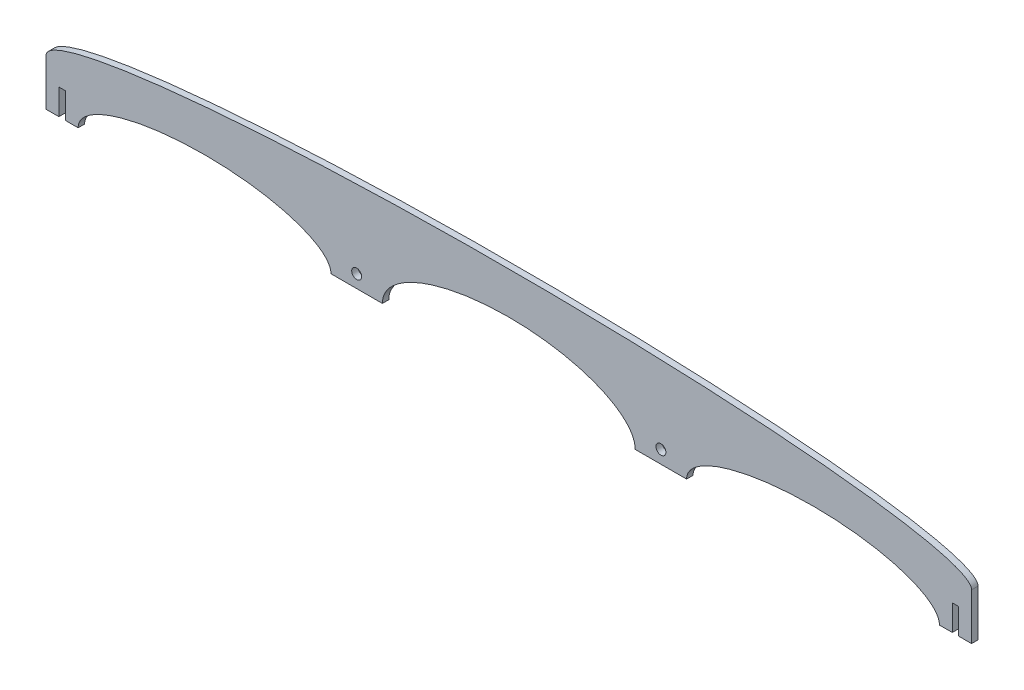
ISO-10303-21;
HEADER;
FILE_DESCRIPTION(('STEP AP214'),'2;1');
FILE_NAME('part.step','',(''),(''),'','','');
FILE_SCHEMA(('AUTOMOTIVE_DESIGN { 1 0 10303 214 1 1 1 1 }'));
ENDSEC;
DATA;
#1=APPLICATION_CONTEXT('core data for automotive mechanical design processes');
#2=APPLICATION_PROTOCOL_DEFINITION('international standard','automotive_design',2000,#1);
#3=PRODUCT_CONTEXT('',#1,'mechanical');
#4=PRODUCT('Part','Part','',(#3));
#5=PRODUCT_RELATED_PRODUCT_CATEGORY('part','',(#4));
#6=PRODUCT_DEFINITION_FORMATION('','',#4);
#7=PRODUCT_DEFINITION_CONTEXT('part definition',#1,'design');
#8=PRODUCT_DEFINITION('design','',#6,#7);
#9=PRODUCT_DEFINITION_SHAPE('','',#8);
#10=(LENGTH_UNIT() NAMED_UNIT(*) SI_UNIT(.MILLI.,.METRE.));
#11=(NAMED_UNIT(*) PLANE_ANGLE_UNIT() SI_UNIT($,.RADIAN.));
#12=(NAMED_UNIT(*) SI_UNIT($,.STERADIAN.) SOLID_ANGLE_UNIT());
#13=UNCERTAINTY_MEASURE_WITH_UNIT(LENGTH_MEASURE(1.E-05),#10,'distance_accuracy_value','');
#14=(GEOMETRIC_REPRESENTATION_CONTEXT(3) GLOBAL_UNCERTAINTY_ASSIGNED_CONTEXT((#13)) GLOBAL_UNIT_ASSIGNED_CONTEXT((#10,
#11,#12)) REPRESENTATION_CONTEXT('',''));
#15=CARTESIAN_POINT('',(0.,0.,0.));
#16=DIRECTION('',(0.,0.,1.));
#17=DIRECTION('',(1.,0.,0.));
#18=AXIS2_PLACEMENT_3D('',#15,#16,#17);
#19=CARTESIAN_POINT('',(0.,0.,3.175));
#20=DIRECTION('',(0.,0.,1.));
#21=DIRECTION('',(-1.,0.,0.));
#22=AXIS2_PLACEMENT_3D('',#19,#20,#21);
#23=ELLIPSE('',#22,228.6,23.01875);
#24=DIRECTION('',(0.,0.,-1.));
#25=VECTOR('',#24,1.);
#26=SURFACE_OF_LINEAR_EXTRUSION('',#23,#25);
#27=CARTESIAN_POINT('',(0.,0.,0.));
#28=DIRECTION('',(0.,0.,1.));
#29=DIRECTION('',(-1.,0.,0.));
#30=AXIS2_PLACEMENT_3D('',#27,#28,#29);
#31=ELLIPSE('',#30,228.6,23.01875);
#32=CARTESIAN_POINT('',(228.6,0.,0.));
#33=VERTEX_POINT('',#32);
#34=CARTESIAN_POINT('',(-228.6,0.,0.));
#35=VERTEX_POINT('',#34);
#36=EDGE_CURVE('E195',#33,#35,#31,.T.);
#37=ORIENTED_EDGE('',*,*,#36,.T.);
#38=DIRECTION('',(0.,0.,-1.));
#39=VECTOR('',#38,1.);
#40=CARTESIAN_POINT('',(-228.6,0.,3.175));
#41=LINE('',#40,#39);
#42=CARTESIAN_POINT('',(-228.6,0.,3.175));
#43=VERTEX_POINT('',#42);
#44=EDGE_CURVE('E11',#43,#35,#41,.T.);
#45=ORIENTED_EDGE('',*,*,#44,.F.);
#46=CARTESIAN_POINT('',(228.6,0.,3.175));
#47=VERTEX_POINT('',#46);
#48=EDGE_CURVE('E230',#47,#43,#23,.T.);
#49=ORIENTED_EDGE('',*,*,#48,.F.);
#50=DIRECTION('',(0.,0.,-1.));
#51=VECTOR('',#50,1.);
#52=CARTESIAN_POINT('',(228.6,0.,3.175));
#53=LINE('',#52,#51);
#54=EDGE_CURVE('E191',#47,#33,#53,.T.);
#55=ORIENTED_EDGE('',*,*,#54,.T.);
#56=EDGE_LOOP('',(#37,#45,#49,#55));
#57=FACE_BOUND('',#56,.T.);
#58=ADVANCED_FACE('F37',(#57),#26,.F.);
#59=CARTESIAN_POINT('',(-228.6,0.,3.175));
#60=DIRECTION('',(1.,0.,0.));
#61=DIRECTION('',(0.,0.,-1.));
#62=AXIS2_PLACEMENT_3D('',#59,#60,#61);
#63=PLANE('',#62);
#64=DIRECTION('',(0.,-1.,0.));
#65=VECTOR('',#64,1.);
#66=CARTESIAN_POINT('',(-228.6,0.,0.));
#67=LINE('',#66,#65);
#68=CARTESIAN_POINT('',(-228.6,-23.01875,0.));
#69=VERTEX_POINT('',#68);
#70=EDGE_CURVE('E198',#35,#69,#67,.T.);
#71=ORIENTED_EDGE('',*,*,#70,.T.);
#72=DIRECTION('',(0.,0.,-1.));
#73=VECTOR('',#72,1.);
#74=CARTESIAN_POINT('',(-228.6,-23.01875,3.175));
#75=LINE('',#74,#73);
#76=CARTESIAN_POINT('',(-228.6,-23.01875,3.175));
#77=VERTEX_POINT('',#76);
#78=EDGE_CURVE('E47',#77,#69,#75,.T.);
#79=ORIENTED_EDGE('',*,*,#78,.F.);
#80=DIRECTION('',(0.,-1.,0.));
#81=VECTOR('',#80,1.);
#82=CARTESIAN_POINT('',(-228.6,0.,3.175));
#83=LINE('',#82,#81);
#84=EDGE_CURVE('E128',#43,#77,#83,.T.);
#85=ORIENTED_EDGE('',*,*,#84,.F.);
#86=ORIENTED_EDGE('',*,*,#44,.T.);
#87=EDGE_LOOP('',(#71,#79,#85,#86));
#88=FACE_BOUND('',#87,.T.);
#89=ADVANCED_FACE('F328',(#88),#63,.F.);
#90=CARTESIAN_POINT('',(-228.6,-23.01875,3.175));
#91=DIRECTION('',(0.,1.,0.));
#92=DIRECTION('',(0.,0.,1.));
#93=AXIS2_PLACEMENT_3D('',#90,#91,#92);
#94=PLANE('',#93);
#95=DIRECTION('',(1.,0.,0.));
#96=VECTOR('',#95,1.);
#97=CARTESIAN_POINT('',(-228.6,-23.01875,0.));
#98=LINE('',#97,#96);
#99=CARTESIAN_POINT('',(-222.25,-23.01875,0.));
#100=VERTEX_POINT('',#99);
#101=EDGE_CURVE('E201',#69,#100,#98,.T.);
#102=ORIENTED_EDGE('',*,*,#101,.T.);
#103=DIRECTION('',(0.,0.,-1.));
#104=VECTOR('',#103,1.);
#105=CARTESIAN_POINT('',(-222.25,-23.01875,3.175));
#106=LINE('',#105,#104);
#107=CARTESIAN_POINT('',(-222.25,-23.01875,3.175));
#108=VERTEX_POINT('',#107);
#109=EDGE_CURVE('E267',#108,#100,#106,.T.);
#110=ORIENTED_EDGE('',*,*,#109,.F.);
#111=DIRECTION('',(1.,0.,0.));
#112=VECTOR('',#111,1.);
#113=CARTESIAN_POINT('',(-228.6,-23.01875,3.175));
#114=LINE('',#113,#112);
#115=EDGE_CURVE('E276',#77,#108,#114,.T.);
#116=ORIENTED_EDGE('',*,*,#115,.F.);
#117=ORIENTED_EDGE('',*,*,#78,.T.);
#118=EDGE_LOOP('',(#102,#110,#116,#117));
#119=FACE_BOUND('',#118,.T.);
#120=ADVANCED_FACE('F274',(#119),#94,.F.);
#121=CARTESIAN_POINT('',(-222.25,-23.01875,3.175));
#122=DIRECTION('',(-1.,0.,0.));
#123=DIRECTION('',(0.,0.,1.));
#124=AXIS2_PLACEMENT_3D('',#121,#122,#123);
#125=PLANE('',#124);
#126=DIRECTION('',(0.,1.,0.));
#127=VECTOR('',#126,1.);
#128=CARTESIAN_POINT('',(-222.25,-23.01875,0.));
#129=LINE('',#128,#127);
#130=CARTESIAN_POINT('',(-222.25,-10.31875,0.));
#131=VERTEX_POINT('',#130);
#132=EDGE_CURVE('E203',#100,#131,#129,.T.);
#133=ORIENTED_EDGE('',*,*,#132,.T.);
#134=DIRECTION('',(0.,0.,-1.));
#135=VECTOR('',#134,1.);
#136=CARTESIAN_POINT('',(-222.25,-10.31875,3.175));
#137=LINE('',#136,#135);
#138=CARTESIAN_POINT('',(-222.25,-10.31875,3.175));
#139=VERTEX_POINT('',#138);
#140=EDGE_CURVE('E264',#139,#131,#137,.T.);
#141=ORIENTED_EDGE('',*,*,#140,.F.);
#142=DIRECTION('',(0.,1.,0.));
#143=VECTOR('',#142,1.);
#144=CARTESIAN_POINT('',(-222.25,-23.01875,3.175));
#145=LINE('',#144,#143);
#146=EDGE_CURVE('E294',#108,#139,#145,.T.);
#147=ORIENTED_EDGE('',*,*,#146,.F.);
#148=ORIENTED_EDGE('',*,*,#109,.T.);
#149=EDGE_LOOP('',(#133,#141,#147,#148));
#150=FACE_BOUND('',#149,.T.);
#151=ADVANCED_FACE('F285',(#150),#125,.F.);
#152=CARTESIAN_POINT('',(-222.25,-10.31875,3.175));
#153=DIRECTION('',(0.,1.,0.));
#154=DIRECTION('',(0.,0.,1.));
#155=AXIS2_PLACEMENT_3D('',#152,#153,#154);
#156=PLANE('',#155);
#157=DIRECTION('',(1.,0.,0.));
#158=VECTOR('',#157,1.);
#159=CARTESIAN_POINT('',(-222.25,-10.31875,0.));
#160=LINE('',#159,#158);
#161=CARTESIAN_POINT('',(-219.075,-10.31875,0.));
#162=VERTEX_POINT('',#161);
#163=EDGE_CURVE('E205',#131,#162,#160,.T.);
#164=ORIENTED_EDGE('',*,*,#163,.T.);
#165=DIRECTION('',(0.,0.,-1.));
#166=VECTOR('',#165,1.);
#167=CARTESIAN_POINT('',(-219.075,-10.31875,3.175));
#168=LINE('',#167,#166);
#169=CARTESIAN_POINT('',(-219.075,-10.31875,3.175));
#170=VERTEX_POINT('',#169);
#171=EDGE_CURVE('E261',#170,#162,#168,.T.);
#172=ORIENTED_EDGE('',*,*,#171,.F.);
#173=DIRECTION('',(1.,0.,0.));
#174=VECTOR('',#173,1.);
#175=CARTESIAN_POINT('',(-222.25,-10.31875,3.175));
#176=LINE('',#175,#174);
#177=EDGE_CURVE('E291',#139,#170,#176,.T.);
#178=ORIENTED_EDGE('',*,*,#177,.F.);
#179=ORIENTED_EDGE('',*,*,#140,.T.);
#180=EDGE_LOOP('',(#164,#172,#178,#179));
#181=FACE_BOUND('',#180,.T.);
#182=ADVANCED_FACE('F289',(#181),#156,.F.);
#183=CARTESIAN_POINT('',(-219.075,-10.31875,3.175));
#184=DIRECTION('',(1.,0.,0.));
#185=DIRECTION('',(0.,0.,-1.));
#186=AXIS2_PLACEMENT_3D('',#183,#184,#185);
#187=PLANE('',#186);
#188=DIRECTION('',(0.,-1.,0.));
#189=VECTOR('',#188,1.);
#190=CARTESIAN_POINT('',(-219.075,-10.31875,0.));
#191=LINE('',#190,#189);
#192=CARTESIAN_POINT('',(-219.075,-23.01875,0.));
#193=VERTEX_POINT('',#192);
#194=EDGE_CURVE('E207',#162,#193,#191,.T.);
#195=ORIENTED_EDGE('',*,*,#194,.T.);
#196=DIRECTION('',(0.,0.,-1.));
#197=VECTOR('',#196,1.);
#198=CARTESIAN_POINT('',(-219.075,-23.01875,3.175));
#199=LINE('',#198,#197);
#200=CARTESIAN_POINT('',(-219.075,-23.01875,3.175));
#201=VERTEX_POINT('',#200);
#202=EDGE_CURVE('E258',#201,#193,#199,.T.);
#203=ORIENTED_EDGE('',*,*,#202,.F.);
#204=DIRECTION('',(0.,-1.,0.));
#205=VECTOR('',#204,1.);
#206=CARTESIAN_POINT('',(-219.075,-10.31875,3.175));
#207=LINE('',#206,#205);
#208=EDGE_CURVE('E293',#170,#201,#207,.T.);
#209=ORIENTED_EDGE('',*,*,#208,.F.);
#210=ORIENTED_EDGE('',*,*,#171,.T.);
#211=EDGE_LOOP('',(#195,#203,#209,#210));
#212=FACE_BOUND('',#211,.T.);
#213=ADVANCED_FACE('F318',(#212),#187,.F.);
#214=CARTESIAN_POINT('',(-219.075,-23.01875,3.175));
#215=DIRECTION('',(0.,1.,0.));
#216=DIRECTION('',(0.,0.,1.));
#217=AXIS2_PLACEMENT_3D('',#214,#215,#216);
#218=PLANE('',#217);
#219=DIRECTION('',(1.,0.,0.));
#220=VECTOR('',#219,1.);
#221=CARTESIAN_POINT('',(-219.075,-23.01875,0.));
#222=LINE('',#221,#220);
#223=CARTESIAN_POINT('',(-212.725,-23.01875,0.));
#224=VERTEX_POINT('',#223);
#225=EDGE_CURVE('E209',#193,#224,#222,.T.);
#226=ORIENTED_EDGE('',*,*,#225,.T.);
#227=DIRECTION('',(0.,0.,-1.));
#228=VECTOR('',#227,1.);
#229=CARTESIAN_POINT('',(-212.725,-23.01875,3.175));
#230=LINE('',#229,#228);
#231=CARTESIAN_POINT('',(-212.725,-23.01875,3.175));
#232=VERTEX_POINT('',#231);
#233=EDGE_CURVE('E255',#232,#224,#230,.T.);
#234=ORIENTED_EDGE('',*,*,#233,.F.);
#235=DIRECTION('',(1.,0.,0.));
#236=VECTOR('',#235,1.);
#237=CARTESIAN_POINT('',(-219.075,-23.01875,3.175));
#238=LINE('',#237,#236);
#239=EDGE_CURVE('E296',#201,#232,#238,.T.);
#240=ORIENTED_EDGE('',*,*,#239,.F.);
#241=ORIENTED_EDGE('',*,*,#202,.T.);
#242=EDGE_LOOP('',(#226,#234,#240,#241));
#243=FACE_BOUND('',#242,.T.);
#244=ADVANCED_FACE('F313',(#243),#218,.F.);
#245=CARTESIAN_POINT('',(-150.283333333333,-23.01875,3.175));
#246=DIRECTION('',(0.,0.,-1.));
#247=DIRECTION('',(-1.,0.,0.));
#248=AXIS2_PLACEMENT_3D('',#245,#246,#247);
#249=ELLIPSE('',#248,62.4416666666666,19.7266914863035);
#250=DIRECTION('',(0.,0.,-1.));
#251=VECTOR('',#250,1.);
#252=SURFACE_OF_LINEAR_EXTRUSION('',#249,#251);
#253=CARTESIAN_POINT('',(-150.283333333333,-23.01875,0.));
#254=DIRECTION('',(0.,0.,-1.));
#255=DIRECTION('',(-1.,0.,0.));
#256=AXIS2_PLACEMENT_3D('',#253,#254,#255);
#257=ELLIPSE('',#256,62.4416666666666,19.7266914863035);
#258=CARTESIAN_POINT('',(-87.8416666666667,-23.01875,0.));
#259=VERTEX_POINT('',#258);
#260=EDGE_CURVE('E211',#224,#259,#257,.T.);
#261=ORIENTED_EDGE('',*,*,#260,.T.);
#262=DIRECTION('',(0.,0.,-1.));
#263=VECTOR('',#262,1.);
#264=CARTESIAN_POINT('',(-87.8416666666667,-23.01875,3.175));
#265=LINE('',#264,#263);
#266=CARTESIAN_POINT('',(-87.8416666666667,-23.01875,3.175));
#267=VERTEX_POINT('',#266);
#268=EDGE_CURVE('E252',#267,#259,#265,.T.);
#269=ORIENTED_EDGE('',*,*,#268,.F.);
#270=EDGE_CURVE('E302',#232,#267,#249,.T.);
#271=ORIENTED_EDGE('',*,*,#270,.F.);
#272=ORIENTED_EDGE('',*,*,#233,.T.);
#273=EDGE_LOOP('',(#261,#269,#271,#272));
#274=FACE_BOUND('',#273,.T.);
#275=ADVANCED_FACE('F308',(#274),#252,.F.);
#276=CARTESIAN_POINT('',(-87.8416666666667,-23.01875,3.175));
#277=DIRECTION('',(0.,1.,0.));
#278=DIRECTION('',(0.,0.,1.));
#279=AXIS2_PLACEMENT_3D('',#276,#277,#278);
#280=PLANE('',#279);
#281=DIRECTION('',(1.,0.,0.));
#282=VECTOR('',#281,1.);
#283=CARTESIAN_POINT('',(-87.8416666666667,-23.01875,0.));
#284=LINE('',#283,#282);
#285=CARTESIAN_POINT('',(-62.4416666666667,-23.01875,0.));
#286=VERTEX_POINT('',#285);
#287=EDGE_CURVE('E213',#259,#286,#284,.T.);
#288=ORIENTED_EDGE('',*,*,#287,.T.);
#289=DIRECTION('',(0.,0.,-1.));
#290=VECTOR('',#289,1.);
#291=CARTESIAN_POINT('',(-62.4416666666667,-23.01875,3.175));
#292=LINE('',#291,#290);
#293=CARTESIAN_POINT('',(-62.4416666666667,-23.01875,3.175));
#294=VERTEX_POINT('',#293);
#295=EDGE_CURVE('E249',#294,#286,#292,.T.);
#296=ORIENTED_EDGE('',*,*,#295,.F.);
#297=DIRECTION('',(1.,0.,0.));
#298=VECTOR('',#297,1.);
#299=CARTESIAN_POINT('',(-87.8416666666667,-23.01875,3.175));
#300=LINE('',#299,#298);
#301=EDGE_CURVE('E305',#267,#294,#300,.T.);
#302=ORIENTED_EDGE('',*,*,#301,.F.);
#303=ORIENTED_EDGE('',*,*,#268,.T.);
#304=EDGE_LOOP('',(#288,#296,#302,#303));
#305=FACE_BOUND('',#304,.T.);
#306=ADVANCED_FACE('F312',(#305),#280,.F.);
#307=CARTESIAN_POINT('',(0.,-23.01875,3.175));
#308=DIRECTION('',(0.,0.,-1.));
#309=DIRECTION('',(-1.,0.,0.));
#310=AXIS2_PLACEMENT_3D('',#307,#308,#309);
#311=ELLIPSE('',#310,62.4416666666667,25.4);
#312=DIRECTION('',(0.,0.,-1.));
#313=VECTOR('',#312,1.);
#314=SURFACE_OF_LINEAR_EXTRUSION('',#311,#313);
#315=CARTESIAN_POINT('',(0.,-23.01875,0.));
#316=DIRECTION('',(0.,0.,-1.));
#317=DIRECTION('',(-1.,0.,0.));
#318=AXIS2_PLACEMENT_3D('',#315,#316,#317);
#319=ELLIPSE('',#318,62.4416666666667,25.4);
#320=CARTESIAN_POINT('',(62.4416666666667,-23.01875,0.));
#321=VERTEX_POINT('',#320);
#322=EDGE_CURVE('E215',#286,#321,#319,.T.);
#323=ORIENTED_EDGE('',*,*,#322,.T.);
#324=DIRECTION('',(0.,0.,-1.));
#325=VECTOR('',#324,1.);
#326=CARTESIAN_POINT('',(62.4416666666667,-23.01875,3.175));
#327=LINE('',#326,#325);
#328=CARTESIAN_POINT('',(62.4416666666667,-23.01875,3.175));
#329=VERTEX_POINT('',#328);
#330=EDGE_CURVE('E246',#329,#321,#327,.T.);
#331=ORIENTED_EDGE('',*,*,#330,.F.);
#332=EDGE_CURVE('E368',#294,#329,#311,.T.);
#333=ORIENTED_EDGE('',*,*,#332,.F.);
#334=ORIENTED_EDGE('',*,*,#295,.T.);
#335=EDGE_LOOP('',(#323,#331,#333,#334));
#336=FACE_BOUND('',#335,.T.);
#337=ADVANCED_FACE('F367',(#336),#314,.F.);
#338=CARTESIAN_POINT('',(62.4416666666667,-23.01875,3.175));
#339=DIRECTION('',(0.,1.,0.));
#340=DIRECTION('',(0.,0.,1.));
#341=AXIS2_PLACEMENT_3D('',#338,#339,#340);
#342=PLANE('',#341);
#343=DIRECTION('',(1.,0.,0.));
#344=VECTOR('',#343,1.);
#345=CARTESIAN_POINT('',(62.4416666666667,-23.01875,0.));
#346=LINE('',#345,#344);
#347=CARTESIAN_POINT('',(87.8416666666667,-23.01875,0.));
#348=VERTEX_POINT('',#347);
#349=EDGE_CURVE('E217',#321,#348,#346,.T.);
#350=ORIENTED_EDGE('',*,*,#349,.T.);
#351=DIRECTION('',(0.,0.,-1.));
#352=VECTOR('',#351,1.);
#353=CARTESIAN_POINT('',(87.8416666666667,-23.01875,3.175));
#354=LINE('',#353,#352);
#355=CARTESIAN_POINT('',(87.8416666666667,-23.01875,3.175));
#356=VERTEX_POINT('',#355);
#357=EDGE_CURVE('E243',#356,#348,#354,.T.);
#358=ORIENTED_EDGE('',*,*,#357,.F.);
#359=DIRECTION('',(1.,0.,0.));
#360=VECTOR('',#359,1.);
#361=CARTESIAN_POINT('',(62.4416666666667,-23.01875,3.175));
#362=LINE('',#361,#360);
#363=EDGE_CURVE('E363',#329,#356,#362,.T.);
#364=ORIENTED_EDGE('',*,*,#363,.F.);
#365=ORIENTED_EDGE('',*,*,#330,.T.);
#366=EDGE_LOOP('',(#350,#358,#364,#365));
#367=FACE_BOUND('',#366,.T.);
#368=ADVANCED_FACE('F362',(#367),#342,.F.);
#369=CARTESIAN_POINT('',(150.283333333333,-23.01875,3.175));
#370=DIRECTION('',(0.,0.,-1.));
#371=DIRECTION('',(-1.,0.,0.));
#372=AXIS2_PLACEMENT_3D('',#369,#370,#371);
#373=ELLIPSE('',#372,62.4416666666667,19.7266914863035);
#374=DIRECTION('',(0.,0.,-1.));
#375=VECTOR('',#374,1.);
#376=SURFACE_OF_LINEAR_EXTRUSION('',#373,#375);
#377=CARTESIAN_POINT('',(150.283333333333,-23.01875,0.));
#378=DIRECTION('',(0.,0.,-1.));
#379=DIRECTION('',(-1.,0.,0.));
#380=AXIS2_PLACEMENT_3D('',#377,#378,#379);
#381=ELLIPSE('',#380,62.4416666666667,19.7266914863035);
#382=CARTESIAN_POINT('',(212.725,-23.01875,0.));
#383=VERTEX_POINT('',#382);
#384=EDGE_CURVE('E219',#348,#383,#381,.T.);
#385=ORIENTED_EDGE('',*,*,#384,.T.);
#386=DIRECTION('',(0.,0.,-1.));
#387=VECTOR('',#386,1.);
#388=CARTESIAN_POINT('',(212.725,-23.01875,3.175));
#389=LINE('',#388,#387);
#390=CARTESIAN_POINT('',(212.725,-23.01875,3.175));
#391=VERTEX_POINT('',#390);
#392=EDGE_CURVE('E240',#391,#383,#389,.T.);
#393=ORIENTED_EDGE('',*,*,#392,.F.);
#394=EDGE_CURVE('E359',#356,#391,#373,.T.);
#395=ORIENTED_EDGE('',*,*,#394,.F.);
#396=ORIENTED_EDGE('',*,*,#357,.T.);
#397=EDGE_LOOP('',(#385,#393,#395,#396));
#398=FACE_BOUND('',#397,.T.);
#399=ADVANCED_FACE('F356',(#398),#376,.F.);
#400=CARTESIAN_POINT('',(219.075,-23.01875,3.175));
#401=DIRECTION('',(0.,1.,0.));
#402=DIRECTION('',(0.,0.,1.));
#403=AXIS2_PLACEMENT_3D('',#400,#401,#402);
#404=PLANE('',#403);
#405=DIRECTION('',(1.,0.,0.));
#406=VECTOR('',#405,1.);
#407=CARTESIAN_POINT('',(219.075,-23.01875,0.));
#408=LINE('',#407,#406);
#409=CARTESIAN_POINT('',(219.075,-23.01875,0.));
#410=VERTEX_POINT('',#409);
#411=EDGE_CURVE('E221',#383,#410,#408,.T.);
#412=ORIENTED_EDGE('',*,*,#411,.T.);
#413=DIRECTION('',(0.,0.,-1.));
#414=VECTOR('',#413,1.);
#415=CARTESIAN_POINT('',(219.075,-23.01875,3.175));
#416=LINE('',#415,#414);
#417=CARTESIAN_POINT('',(219.075,-23.01875,3.175));
#418=VERTEX_POINT('',#417);
#419=EDGE_CURVE('E237',#418,#410,#416,.T.);
#420=ORIENTED_EDGE('',*,*,#419,.F.);
#421=DIRECTION('',(1.,0.,0.));
#422=VECTOR('',#421,1.);
#423=CARTESIAN_POINT('',(219.075,-23.01875,3.175));
#424=LINE('',#423,#422);
#425=EDGE_CURVE('E350',#391,#418,#424,.T.);
#426=ORIENTED_EDGE('',*,*,#425,.F.);
#427=ORIENTED_EDGE('',*,*,#392,.T.);
#428=EDGE_LOOP('',(#412,#420,#426,#427));
#429=FACE_BOUND('',#428,.T.);
#430=ADVANCED_FACE('F349',(#429),#404,.F.);
#431=CARTESIAN_POINT('',(219.075,-10.31875,3.175));
#432=DIRECTION('',(-1.,0.,0.));
#433=DIRECTION('',(0.,0.,1.));
#434=AXIS2_PLACEMENT_3D('',#431,#432,#433);
#435=PLANE('',#434);
#436=DIRECTION('',(0.,1.,0.));
#437=VECTOR('',#436,1.);
#438=CARTESIAN_POINT('',(219.075,-10.31875,0.));
#439=LINE('',#438,#437);
#440=CARTESIAN_POINT('',(219.075,-10.31875,0.));
#441=VERTEX_POINT('',#440);
#442=EDGE_CURVE('E223',#410,#441,#439,.T.);
#443=ORIENTED_EDGE('',*,*,#442,.T.);
#444=DIRECTION('',(0.,0.,-1.));
#445=VECTOR('',#444,1.);
#446=CARTESIAN_POINT('',(219.075,-10.31875,3.175));
#447=LINE('',#446,#445);
#448=CARTESIAN_POINT('',(219.075,-10.31875,3.175));
#449=VERTEX_POINT('',#448);
#450=EDGE_CURVE('E234',#449,#441,#447,.T.);
#451=ORIENTED_EDGE('',*,*,#450,.F.);
#452=DIRECTION('',(0.,1.,0.));
#453=VECTOR('',#452,1.);
#454=CARTESIAN_POINT('',(219.075,-10.31875,3.175));
#455=LINE('',#454,#453);
#456=EDGE_CURVE('E345',#418,#449,#455,.T.);
#457=ORIENTED_EDGE('',*,*,#456,.F.);
#458=ORIENTED_EDGE('',*,*,#419,.T.);
#459=EDGE_LOOP('',(#443,#451,#457,#458));
#460=FACE_BOUND('',#459,.T.);
#461=ADVANCED_FACE('F344',(#460),#435,.F.);
#462=CARTESIAN_POINT('',(222.25,-10.31875,3.175));
#463=DIRECTION('',(0.,1.,0.));
#464=DIRECTION('',(0.,0.,1.));
#465=AXIS2_PLACEMENT_3D('',#462,#463,#464);
#466=PLANE('',#465);
#467=DIRECTION('',(1.,0.,0.));
#468=VECTOR('',#467,1.);
#469=CARTESIAN_POINT('',(222.25,-10.31875,0.));
#470=LINE('',#469,#468);
#471=CARTESIAN_POINT('',(222.25,-10.31875,0.));
#472=VERTEX_POINT('',#471);
#473=EDGE_CURVE('E225',#441,#472,#470,.T.);
#474=ORIENTED_EDGE('',*,*,#473,.T.);
#475=DIRECTION('',(0.,0.,-1.));
#476=VECTOR('',#475,1.);
#477=CARTESIAN_POINT('',(222.25,-10.31875,3.175));
#478=LINE('',#477,#476);
#479=CARTESIAN_POINT('',(222.25,-10.31875,3.175));
#480=VERTEX_POINT('',#479);
#481=EDGE_CURVE('E186',#480,#472,#478,.T.);
#482=ORIENTED_EDGE('',*,*,#481,.F.);
#483=DIRECTION('',(1.,0.,0.));
#484=VECTOR('',#483,1.);
#485=CARTESIAN_POINT('',(222.25,-10.31875,3.175));
#486=LINE('',#485,#484);
#487=EDGE_CURVE('E177',#449,#480,#486,.T.);
#488=ORIENTED_EDGE('',*,*,#487,.F.);
#489=ORIENTED_EDGE('',*,*,#450,.T.);
#490=EDGE_LOOP('',(#474,#482,#488,#489));
#491=FACE_BOUND('',#490,.T.);
#492=ADVANCED_FACE('F340',(#491),#466,.F.);
#493=CARTESIAN_POINT('',(222.25,-23.01875,3.175));
#494=DIRECTION('',(1.,0.,0.));
#495=DIRECTION('',(0.,0.,-1.));
#496=AXIS2_PLACEMENT_3D('',#493,#494,#495);
#497=PLANE('',#496);
#498=DIRECTION('',(0.,-1.,0.));
#499=VECTOR('',#498,1.);
#500=CARTESIAN_POINT('',(222.25,-23.01875,0.));
#501=LINE('',#500,#499);
#502=CARTESIAN_POINT('',(222.25,-23.01875,0.));
#503=VERTEX_POINT('',#502);
#504=EDGE_CURVE('E185',#472,#503,#501,.T.);
#505=ORIENTED_EDGE('',*,*,#504,.T.);
#506=DIRECTION('',(0.,0.,-1.));
#507=VECTOR('',#506,1.);
#508=CARTESIAN_POINT('',(222.25,-23.01875,3.175));
#509=LINE('',#508,#507);
#510=CARTESIAN_POINT('',(222.25,-23.01875,3.175));
#511=VERTEX_POINT('',#510);
#512=EDGE_CURVE('E182',#511,#503,#509,.T.);
#513=ORIENTED_EDGE('',*,*,#512,.F.);
#514=DIRECTION('',(0.,-1.,0.));
#515=VECTOR('',#514,1.);
#516=CARTESIAN_POINT('',(222.25,-23.01875,3.175));
#517=LINE('',#516,#515);
#518=EDGE_CURVE('E171',#480,#511,#517,.T.);
#519=ORIENTED_EDGE('',*,*,#518,.F.);
#520=ORIENTED_EDGE('',*,*,#481,.T.);
#521=EDGE_LOOP('',(#505,#513,#519,#520));
#522=FACE_BOUND('',#521,.T.);
#523=ADVANCED_FACE('F183',(#522),#497,.F.);
#524=CARTESIAN_POINT('',(228.6,-23.01875,3.175));
#525=DIRECTION('',(0.,1.,0.));
#526=DIRECTION('',(0.,0.,1.));
#527=AXIS2_PLACEMENT_3D('',#524,#525,#526);
#528=PLANE('',#527);
#529=DIRECTION('',(1.,0.,0.));
#530=VECTOR('',#529,1.);
#531=CARTESIAN_POINT('',(228.6,-23.01875,0.));
#532=LINE('',#531,#530);
#533=CARTESIAN_POINT('',(228.6,-23.01875,0.));
#534=VERTEX_POINT('',#533);
#535=EDGE_CURVE('E114',#503,#534,#532,.T.);
#536=ORIENTED_EDGE('',*,*,#535,.T.);
#537=DIRECTION('',(0.,0.,-1.));
#538=VECTOR('',#537,1.);
#539=CARTESIAN_POINT('',(228.6,-23.01875,3.175));
#540=LINE('',#539,#538);
#541=CARTESIAN_POINT('',(228.6,-23.01875,3.175));
#542=VERTEX_POINT('',#541);
#543=EDGE_CURVE('E187',#542,#534,#540,.T.);
#544=ORIENTED_EDGE('',*,*,#543,.F.);
#545=DIRECTION('',(1.,0.,0.));
#546=VECTOR('',#545,1.);
#547=CARTESIAN_POINT('',(228.6,-23.01875,3.175));
#548=LINE('',#547,#546);
#549=EDGE_CURVE('E175',#511,#542,#548,.T.);
#550=ORIENTED_EDGE('',*,*,#549,.F.);
#551=ORIENTED_EDGE('',*,*,#512,.T.);
#552=EDGE_LOOP('',(#536,#544,#550,#551));
#553=FACE_BOUND('',#552,.T.);
#554=ADVANCED_FACE('F189',(#553),#528,.F.);
#555=CARTESIAN_POINT('',(228.6,0.,3.175));
#556=DIRECTION('',(-1.,0.,0.));
#557=DIRECTION('',(0.,-1.,0.));
#558=AXIS2_PLACEMENT_3D('',#555,#556,#557);
#559=PLANE('',#558);
#560=DIRECTION('',(0.,1.,0.));
#561=VECTOR('',#560,1.);
#562=CARTESIAN_POINT('',(228.6,0.,0.));
#563=LINE('',#562,#561);
#564=EDGE_CURVE('E120',#534,#33,#563,.T.);
#565=ORIENTED_EDGE('',*,*,#564,.T.);
#566=ORIENTED_EDGE('',*,*,#54,.F.);
#567=DIRECTION('',(0.,1.,0.));
#568=VECTOR('',#567,1.);
#569=CARTESIAN_POINT('',(228.6,0.,3.175));
#570=LINE('',#569,#568);
#571=EDGE_CURVE('E55',#542,#47,#570,.T.);
#572=ORIENTED_EDGE('',*,*,#571,.F.);
#573=ORIENTED_EDGE('',*,*,#543,.T.);
#574=EDGE_LOOP('',(#565,#566,#572,#573));
#575=FACE_BOUND('',#574,.T.);
#576=ADVANCED_FACE('F402',(#575),#559,.F.);
#577=CARTESIAN_POINT('',(0.,0.,3.175));
#578=DIRECTION('',(0.,0.,1.));
#579=DIRECTION('',(1.,0.,0.));
#580=AXIS2_PLACEMENT_3D('',#577,#578,#579);
#581=PLANE('',#580);
#582=CARTESIAN_POINT('',(-75.1416666666667,-16.66875,3.175));
#583=DIRECTION('',(0.,0.,1.));
#584=DIRECTION('',(1.,0.,0.));
#585=AXIS2_PLACEMENT_3D('',#582,#583,#584);
#586=CIRCLE('',#585,2.45745);
#587=CARTESIAN_POINT('',(-72.6842166666667,-16.66875,3.175));
#588=VERTEX_POINT('',#587);
#589=EDGE_CURVE('E423',#588,#588,#586,.T.);
#590=ORIENTED_EDGE('',*,*,#589,.F.);
#591=EDGE_LOOP('',(#590));
#592=FACE_BOUND('',#591,.T.);
#593=CARTESIAN_POINT('',(75.1416666666667,-16.66875,3.175));
#594=DIRECTION('',(0.,0.,1.));
#595=DIRECTION('',(1.,0.,0.));
#596=AXIS2_PLACEMENT_3D('',#593,#594,#595);
#597=CIRCLE('',#596,2.45745);
#598=CARTESIAN_POINT('',(77.5991166666667,-16.66875,3.175));
#599=VERTEX_POINT('',#598);
#600=EDGE_CURVE('E426',#599,#599,#597,.T.);
#601=ORIENTED_EDGE('',*,*,#600,.F.);
#602=EDGE_LOOP('',(#601));
#603=FACE_BOUND('',#602,.T.);
#604=ORIENTED_EDGE('',*,*,#48,.T.);
#605=ORIENTED_EDGE('',*,*,#84,.T.);
#606=ORIENTED_EDGE('',*,*,#115,.T.);
#607=ORIENTED_EDGE('',*,*,#146,.T.);
#608=ORIENTED_EDGE('',*,*,#177,.T.);
#609=ORIENTED_EDGE('',*,*,#208,.T.);
#610=ORIENTED_EDGE('',*,*,#239,.T.);
#611=ORIENTED_EDGE('',*,*,#270,.T.);
#612=ORIENTED_EDGE('',*,*,#301,.T.);
#613=ORIENTED_EDGE('',*,*,#332,.T.);
#614=ORIENTED_EDGE('',*,*,#363,.T.);
#615=ORIENTED_EDGE('',*,*,#394,.T.);
#616=ORIENTED_EDGE('',*,*,#425,.T.);
#617=ORIENTED_EDGE('',*,*,#456,.T.);
#618=ORIENTED_EDGE('',*,*,#487,.T.);
#619=ORIENTED_EDGE('',*,*,#518,.T.);
#620=ORIENTED_EDGE('',*,*,#549,.T.);
#621=ORIENTED_EDGE('',*,*,#571,.T.);
#622=EDGE_LOOP('',(#604,#605,#606,#607,#608,#609,#610,#611,#612,#613,#614,#615,#616,#617,#618,
#619,#620,#621));
#623=FACE_BOUND('',#622,.T.);
#624=ADVANCED_FACE('F173',(#592,#603,#623),#581,.T.);
#625=CARTESIAN_POINT('',(0.,0.,0.));
#626=DIRECTION('',(0.,0.,1.));
#627=DIRECTION('',(1.,0.,0.));
#628=AXIS2_PLACEMENT_3D('',#625,#626,#627);
#629=PLANE('',#628);
#630=CARTESIAN_POINT('',(-75.1416666666667,-16.66875,0.));
#631=DIRECTION('',(0.,0.,1.));
#632=DIRECTION('',(1.,0.,0.));
#633=AXIS2_PLACEMENT_3D('',#630,#631,#632);
#634=CIRCLE('',#633,2.45745);
#635=CARTESIAN_POINT('',(-72.6842166666667,-16.66875,0.));
#636=VERTEX_POINT('',#635);
#637=EDGE_CURVE('E41',#636,#636,#634,.T.);
#638=ORIENTED_EDGE('',*,*,#637,.T.);
#639=EDGE_LOOP('',(#638));
#640=FACE_BOUND('',#639,.T.);
#641=CARTESIAN_POINT('',(75.1416666666667,-16.66875,0.));
#642=DIRECTION('',(0.,0.,1.));
#643=DIRECTION('',(1.,0.,0.));
#644=AXIS2_PLACEMENT_3D('',#641,#642,#643);
#645=CIRCLE('',#644,2.45745);
#646=CARTESIAN_POINT('',(77.5991166666667,-16.66875,0.));
#647=VERTEX_POINT('',#646);
#648=EDGE_CURVE('E199',#647,#647,#645,.T.);
#649=ORIENTED_EDGE('',*,*,#648,.T.);
#650=EDGE_LOOP('',(#649));
#651=FACE_BOUND('',#650,.T.);
#652=ORIENTED_EDGE('',*,*,#36,.F.);
#653=ORIENTED_EDGE('',*,*,#564,.F.);
#654=ORIENTED_EDGE('',*,*,#535,.F.);
#655=ORIENTED_EDGE('',*,*,#504,.F.);
#656=ORIENTED_EDGE('',*,*,#473,.F.);
#657=ORIENTED_EDGE('',*,*,#442,.F.);
#658=ORIENTED_EDGE('',*,*,#411,.F.);
#659=ORIENTED_EDGE('',*,*,#384,.F.);
#660=ORIENTED_EDGE('',*,*,#349,.F.);
#661=ORIENTED_EDGE('',*,*,#322,.F.);
#662=ORIENTED_EDGE('',*,*,#287,.F.);
#663=ORIENTED_EDGE('',*,*,#260,.F.);
#664=ORIENTED_EDGE('',*,*,#225,.F.);
#665=ORIENTED_EDGE('',*,*,#194,.F.);
#666=ORIENTED_EDGE('',*,*,#163,.F.);
#667=ORIENTED_EDGE('',*,*,#132,.F.);
#668=ORIENTED_EDGE('',*,*,#101,.F.);
#669=ORIENTED_EDGE('',*,*,#70,.F.);
#670=EDGE_LOOP('',(#652,#653,#654,#655,#656,#657,#658,#659,#660,#661,#662,#663,#664,#665,#666,
#667,#668,#669));
#671=FACE_BOUND('',#670,.T.);
#672=ADVANCED_FACE('F280',(#640,#651,#671),#629,.F.);
#673=CARTESIAN_POINT('',(75.1416666666667,-16.66875,3.175));
#674=DIRECTION('',(0.,0.,1.));
#675=DIRECTION('',(1.,0.,0.));
#676=AXIS2_PLACEMENT_3D('',#673,#674,#675);
#677=CYLINDRICAL_SURFACE('',#676,2.45745);
#678=ORIENTED_EDGE('',*,*,#600,.T.);
#679=EDGE_LOOP('',(#678));
#680=FACE_BOUND('',#679,.T.);
#681=ORIENTED_EDGE('',*,*,#648,.F.);
#682=EDGE_LOOP('',(#681));
#683=FACE_BOUND('',#682,.T.);
#684=ADVANCED_FACE('F407',(#680,#683),#677,.F.);
#685=CARTESIAN_POINT('',(-75.1416666666667,-16.66875,3.175));
#686=DIRECTION('',(0.,0.,1.));
#687=DIRECTION('',(1.,0.,0.));
#688=AXIS2_PLACEMENT_3D('',#685,#686,#687);
#689=CYLINDRICAL_SURFACE('',#688,2.45745);
#690=ORIENTED_EDGE('',*,*,#589,.T.);
#691=EDGE_LOOP('',(#690));
#692=FACE_BOUND('',#691,.T.);
#693=ORIENTED_EDGE('',*,*,#637,.F.);
#694=EDGE_LOOP('',(#693));
#695=FACE_BOUND('',#694,.T.);
#696=ADVANCED_FACE('F414',(#692,#695),#689,.F.);
#697=CLOSED_SHELL('',(#58,#89,#120,#151,#182,#213,#244,#275,#306,#337,#368,#399,#430,#461,#492,
#523,#554,#576,#624,#672,#684,#696));
#698=MANIFOLD_SOLID_BREP('B2',#697);
#699=ADVANCED_BREP_SHAPE_REPRESENTATION('',(#18,#698),#14);
#700=SHAPE_DEFINITION_REPRESENTATION(#9,#699);
ENDSEC;
END-ISO-10303-21;
